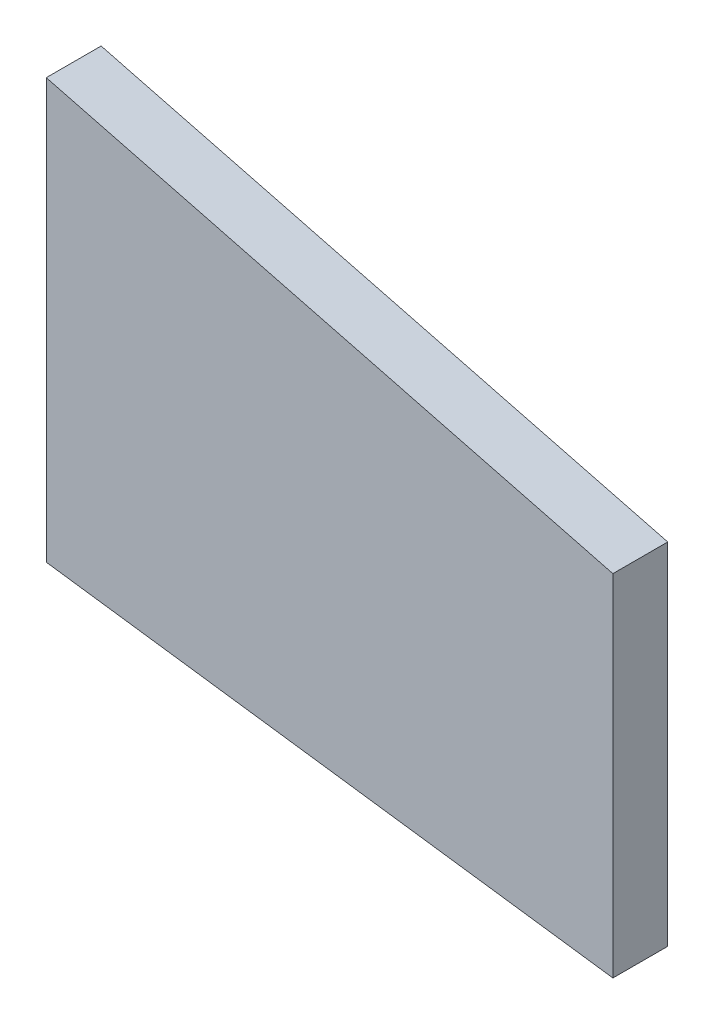
ISO-10303-21;
HEADER;
FILE_DESCRIPTION(('STEP AP214'),'2;1');
FILE_NAME('part.step','',(''),(''),'','','');
FILE_SCHEMA(('AUTOMOTIVE_DESIGN { 1 0 10303 214 1 1 1 1 }'));
ENDSEC;
DATA;
#1=APPLICATION_CONTEXT('core data for automotive mechanical design processes');
#2=APPLICATION_PROTOCOL_DEFINITION('international standard','automotive_design',2000,#1);
#3=PRODUCT_CONTEXT('',#1,'mechanical');
#4=PRODUCT('Part','Part','',(#3));
#5=PRODUCT_RELATED_PRODUCT_CATEGORY('part','',(#4));
#6=PRODUCT_DEFINITION_FORMATION('','',#4);
#7=PRODUCT_DEFINITION_CONTEXT('part definition',#1,'design');
#8=PRODUCT_DEFINITION('design','',#6,#7);
#9=PRODUCT_DEFINITION_SHAPE('','',#8);
#10=(LENGTH_UNIT() NAMED_UNIT(*) SI_UNIT(.MILLI.,.METRE.));
#11=(NAMED_UNIT(*) PLANE_ANGLE_UNIT() SI_UNIT($,.RADIAN.));
#12=(NAMED_UNIT(*) SI_UNIT($,.STERADIAN.) SOLID_ANGLE_UNIT());
#13=UNCERTAINTY_MEASURE_WITH_UNIT(LENGTH_MEASURE(1.E-05),#10,'distance_accuracy_value','');
#14=(GEOMETRIC_REPRESENTATION_CONTEXT(3) GLOBAL_UNCERTAINTY_ASSIGNED_CONTEXT((#13)) GLOBAL_UNIT_ASSIGNED_CONTEXT((#10,
#11,#12)) REPRESENTATION_CONTEXT('',''));
#15=CARTESIAN_POINT('',(0.,0.,0.));
#16=DIRECTION('',(0.,0.,1.));
#17=DIRECTION('',(1.,0.,0.));
#18=AXIS2_PLACEMENT_3D('',#15,#16,#17);
#19=CARTESIAN_POINT('',(0.,0.,19.05));
#20=DIRECTION('',(1.,0.,0.));
#21=DIRECTION('',(0.,0.,-1.));
#22=AXIS2_PLACEMENT_3D('',#19,#20,#21);
#23=PLANE('',#22);
#24=DIRECTION('',(0.,-1.,0.));
#25=VECTOR('',#24,1.);
#26=CARTESIAN_POINT('',(0.,0.,0.));
#27=LINE('',#26,#25);
#28=CARTESIAN_POINT('',(0.,177.8,0.));
#29=VERTEX_POINT('',#28);
#30=CARTESIAN_POINT('',(0.,32.004,0.));
#31=VERTEX_POINT('',#30);
#32=EDGE_CURVE('E90',#29,#31,#27,.T.);
#33=ORIENTED_EDGE('',*,*,#32,.T.);
#34=DIRECTION('',(0.,0.,1.));
#35=VECTOR('',#34,1.);
#36=CARTESIAN_POINT('',(0.,32.004,-762.636405158947));
#37=LINE('',#36,#35);
#38=CARTESIAN_POINT('',(0.,32.004,19.05));
#39=VERTEX_POINT('',#38);
#40=EDGE_CURVE('E53',#31,#39,#37,.T.);
#41=ORIENTED_EDGE('',*,*,#40,.T.);
#42=DIRECTION('',(0.,-1.,0.));
#43=VECTOR('',#42,1.);
#44=CARTESIAN_POINT('',(0.,0.,19.05));
#45=LINE('',#44,#43);
#46=CARTESIAN_POINT('',(0.,177.8,19.05));
#47=VERTEX_POINT('',#46);
#48=EDGE_CURVE('E85',#47,#39,#45,.T.);
#49=ORIENTED_EDGE('',*,*,#48,.F.);
#50=DIRECTION('',(0.,0.,-1.));
#51=VECTOR('',#50,1.);
#52=CARTESIAN_POINT('',(0.,177.8,19.05));
#53=LINE('',#52,#51);
#54=EDGE_CURVE('E78',#47,#29,#53,.T.);
#55=ORIENTED_EDGE('',*,*,#54,.T.);
#56=EDGE_LOOP('',(#33,#41,#49,#55));
#57=FACE_BOUND('',#56,.T.);
#58=ADVANCED_FACE('F39',(#57),#23,.F.);
#59=CARTESIAN_POINT('',(196.85,0.,19.05));
#60=DIRECTION('',(-1.,0.,0.));
#61=DIRECTION('',(0.,0.,1.));
#62=AXIS2_PLACEMENT_3D('',#59,#60,#61);
#63=PLANE('',#62);
#64=DIRECTION('',(0.,1.,0.));
#65=VECTOR('',#64,1.);
#66=CARTESIAN_POINT('',(196.85,0.,19.05));
#67=LINE('',#66,#65);
#68=CARTESIAN_POINT('',(196.85,5.334,19.05));
#69=VERTEX_POINT('',#68);
#70=CARTESIAN_POINT('',(196.85,127.,19.05));
#71=VERTEX_POINT('',#70);
#72=EDGE_CURVE('E106',#69,#71,#67,.T.);
#73=ORIENTED_EDGE('',*,*,#72,.F.);
#74=DIRECTION('',(0.,0.,1.));
#75=VECTOR('',#74,1.);
#76=CARTESIAN_POINT('',(196.85,5.334,-762.636405158947));
#77=LINE('',#76,#75);
#78=CARTESIAN_POINT('',(196.85,5.334,0.));
#79=VERTEX_POINT('',#78);
#80=EDGE_CURVE('E99',#79,#69,#77,.T.);
#81=ORIENTED_EDGE('',*,*,#80,.F.);
#82=DIRECTION('',(0.,1.,0.));
#83=VECTOR('',#82,1.);
#84=CARTESIAN_POINT('',(196.85,0.,0.));
#85=LINE('',#84,#83);
#86=CARTESIAN_POINT('',(196.85,127.,0.));
#87=VERTEX_POINT('',#86);
#88=EDGE_CURVE('E86',#79,#87,#85,.T.);
#89=ORIENTED_EDGE('',*,*,#88,.T.);
#90=DIRECTION('',(0.,0.,-1.));
#91=VECTOR('',#90,1.);
#92=CARTESIAN_POINT('',(196.85,127.,19.05));
#93=LINE('',#92,#91);
#94=EDGE_CURVE('E47',#71,#87,#93,.T.);
#95=ORIENTED_EDGE('',*,*,#94,.F.);
#96=EDGE_LOOP('',(#73,#81,#89,#95));
#97=FACE_BOUND('',#96,.T.);
#98=ADVANCED_FACE('F125',(#97),#63,.F.);
#99=CARTESIAN_POINT('',(0.,177.8,19.05));
#100=DIRECTION('',(-0.24987801902177,-0.968277323709358,0.));
#101=DIRECTION('',(0.968277323709358,-0.24987801902177,0.));
#102=AXIS2_PLACEMENT_3D('',#99,#100,#101);
#103=PLANE('',#102);
#104=DIRECTION('',(-0.968277323709358,0.24987801902177,0.));
#105=VECTOR('',#104,1.);
#106=CARTESIAN_POINT('',(0.,177.8,0.));
#107=LINE('',#106,#105);
#108=EDGE_CURVE('E75',#87,#29,#107,.T.);
#109=ORIENTED_EDGE('',*,*,#108,.T.);
#110=ORIENTED_EDGE('',*,*,#54,.F.);
#111=DIRECTION('',(-0.968277323709358,0.24987801902177,0.));
#112=VECTOR('',#111,1.);
#113=CARTESIAN_POINT('',(0.,177.8,19.05));
#114=LINE('',#113,#112);
#115=EDGE_CURVE('E62',#71,#47,#114,.T.);
#116=ORIENTED_EDGE('',*,*,#115,.F.);
#117=ORIENTED_EDGE('',*,*,#94,.T.);
#118=EDGE_LOOP('',(#109,#110,#116,#117));
#119=FACE_BOUND('',#118,.T.);
#120=ADVANCED_FACE('F77',(#119),#103,.F.);
#121=CARTESIAN_POINT('',(0.,0.,19.05));
#122=DIRECTION('',(0.,0.,-1.));
#123=DIRECTION('',(-1.,0.,0.));
#124=AXIS2_PLACEMENT_3D('',#121,#122,#123);
#125=PLANE('',#124);
#126=ORIENTED_EDGE('',*,*,#48,.T.);
#127=DIRECTION('',(-0.990946510006687,0.13425726909768,0.));
#128=VECTOR('',#127,1.);
#129=CARTESIAN_POINT('',(0.,32.004,19.05));
#130=LINE('',#129,#128);
#131=EDGE_CURVE('E114',#69,#39,#130,.T.);
#132=ORIENTED_EDGE('',*,*,#131,.F.);
#133=ORIENTED_EDGE('',*,*,#72,.T.);
#134=ORIENTED_EDGE('',*,*,#115,.T.);
#135=EDGE_LOOP('',(#126,#132,#133,#134));
#136=FACE_BOUND('',#135,.T.);
#137=ADVANCED_FACE('F122',(#136),#125,.F.);
#138=CARTESIAN_POINT('',(0.,0.,0.));
#139=DIRECTION('',(0.,0.,-1.));
#140=DIRECTION('',(-1.,0.,0.));
#141=AXIS2_PLACEMENT_3D('',#138,#139,#140);
#142=PLANE('',#141);
#143=DIRECTION('',(0.990946510006687,-0.13425726909768,0.));
#144=VECTOR('',#143,1.);
#145=CARTESIAN_POINT('',(4.25786887926102,31.4271274421646,0.));
#146=LINE('',#145,#144);
#147=EDGE_CURVE('E11',#31,#79,#146,.T.);
#148=ORIENTED_EDGE('',*,*,#147,.F.);
#149=ORIENTED_EDGE('',*,*,#32,.F.);
#150=ORIENTED_EDGE('',*,*,#108,.F.);
#151=ORIENTED_EDGE('',*,*,#88,.F.);
#152=EDGE_LOOP('',(#148,#149,#150,#151));
#153=FACE_BOUND('',#152,.T.);
#154=ADVANCED_FACE('F93',(#153),#142,.T.);
#155=CARTESIAN_POINT('',(0.,32.004,-762.636405158947));
#156=DIRECTION('',(0.13425726909768,0.990946510006687,0.));
#157=DIRECTION('',(-0.990946510006687,0.13425726909768,0.));
#158=AXIS2_PLACEMENT_3D('',#155,#156,#157);
#159=PLANE('',#158);
#160=ORIENTED_EDGE('',*,*,#147,.T.);
#161=ORIENTED_EDGE('',*,*,#80,.T.);
#162=ORIENTED_EDGE('',*,*,#131,.T.);
#163=ORIENTED_EDGE('',*,*,#40,.F.);
#164=EDGE_LOOP('',(#160,#161,#162,#163));
#165=FACE_BOUND('',#164,.T.);
#166=ADVANCED_FACE('F117',(#165),#159,.F.);
#167=CLOSED_SHELL('',(#58,#98,#120,#137,#154,#166));
#168=MANIFOLD_SOLID_BREP('B2',#167);
#169=ADVANCED_BREP_SHAPE_REPRESENTATION('',(#18,#168),#14);
#170=SHAPE_DEFINITION_REPRESENTATION(#9,#169);
ENDSEC;
END-ISO-10303-21;
